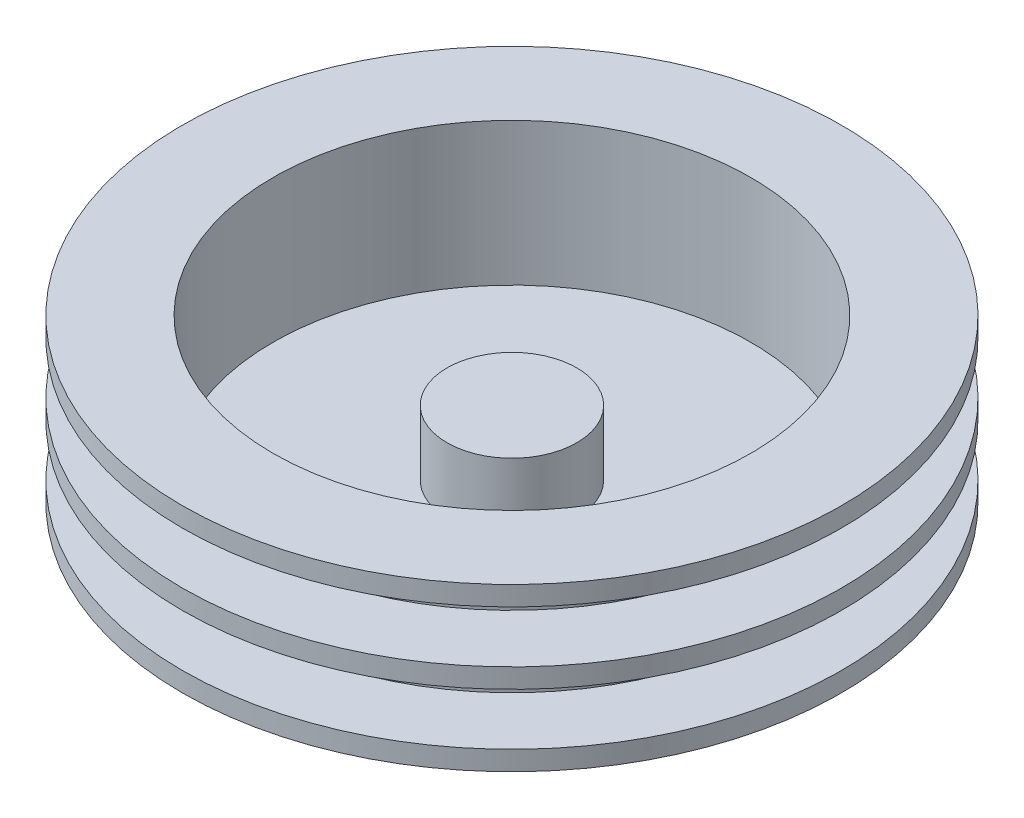
ISO-10303-21;
HEADER;
FILE_DESCRIPTION(('STEP AP214'),'2;1');
FILE_NAME('part.step','',(''),(''),'','','');
FILE_SCHEMA(('AUTOMOTIVE_DESIGN { 1 0 10303 214 1 1 1 1 }'));
ENDSEC;
DATA;
#1=APPLICATION_CONTEXT('core data for automotive mechanical design processes');
#2=APPLICATION_PROTOCOL_DEFINITION('international standard','automotive_design',2000,#1);
#3=PRODUCT_CONTEXT('',#1,'mechanical');
#4=PRODUCT('Part','Part','',(#3));
#5=PRODUCT_RELATED_PRODUCT_CATEGORY('part','',(#4));
#6=PRODUCT_DEFINITION_FORMATION('','',#4);
#7=PRODUCT_DEFINITION_CONTEXT('part definition',#1,'design');
#8=PRODUCT_DEFINITION('design','',#6,#7);
#9=PRODUCT_DEFINITION_SHAPE('','',#8);
#10=(LENGTH_UNIT() NAMED_UNIT(*) SI_UNIT(.MILLI.,.METRE.));
#11=(NAMED_UNIT(*) PLANE_ANGLE_UNIT() SI_UNIT($,.RADIAN.));
#12=(NAMED_UNIT(*) SI_UNIT($,.STERADIAN.) SOLID_ANGLE_UNIT());
#13=UNCERTAINTY_MEASURE_WITH_UNIT(LENGTH_MEASURE(1.E-05),#10,'distance_accuracy_value','');
#14=(GEOMETRIC_REPRESENTATION_CONTEXT(3) GLOBAL_UNCERTAINTY_ASSIGNED_CONTEXT((#13)) GLOBAL_UNIT_ASSIGNED_CONTEXT((#10,
#11,#12)) REPRESENTATION_CONTEXT('',''));
#15=CARTESIAN_POINT('',(0.,0.,0.));
#16=DIRECTION('',(0.,0.,1.));
#17=DIRECTION('',(1.,0.,0.));
#18=AXIS2_PLACEMENT_3D('',#15,#16,#17);
#19=CARTESIAN_POINT('',(0.,7.,0.));
#20=DIRECTION('',(0.,1.,0.));
#21=DIRECTION('',(0.,0.,1.));
#22=AXIS2_PLACEMENT_3D('',#19,#20,#21);
#23=PLANE('',#22);
#24=CARTESIAN_POINT('',(0.,7.,0.));
#25=DIRECTION('',(0.,1.,0.));
#26=DIRECTION('',(0.,0.,1.));
#27=AXIS2_PLACEMENT_3D('',#24,#25,#26);
#28=CIRCLE('',#27,25.4);
#29=CARTESIAN_POINT('',(0.,7.,25.4));
#30=VERTEX_POINT('',#29);
#31=EDGE_CURVE('E75',#30,#30,#28,.T.);
#32=ORIENTED_EDGE('',*,*,#31,.T.);
#33=EDGE_LOOP('',(#32));
#34=FACE_BOUND('',#33,.T.);
#35=CARTESIAN_POINT('',(0.,7.,0.));
#36=DIRECTION('',(0.,1.,0.));
#37=DIRECTION('',(0.,0.,1.));
#38=AXIS2_PLACEMENT_3D('',#35,#36,#37);
#39=CIRCLE('',#38,20.066);
#40=CARTESIAN_POINT('',(0.,7.,20.066));
#41=VERTEX_POINT('',#40);
#42=EDGE_CURVE('E84',#41,#41,#39,.T.);
#43=ORIENTED_EDGE('',*,*,#42,.F.);
#44=EDGE_LOOP('',(#43));
#45=FACE_BOUND('',#44,.T.);
#46=ADVANCED_FACE('F54',(#34,#45),#23,.T.);
#47=CARTESIAN_POINT('',(0.,1.5,0.));
#48=DIRECTION('',(0.,-1.,0.));
#49=DIRECTION('',(0.,0.,-1.));
#50=AXIS2_PLACEMENT_3D('',#47,#48,#49);
#51=CYLINDRICAL_SURFACE('',#50,25.4);
#52=CARTESIAN_POINT('',(0.,1.5,0.));
#53=DIRECTION('',(0.,1.,0.));
#54=DIRECTION('',(0.,0.,1.));
#55=AXIS2_PLACEMENT_3D('',#52,#53,#54);
#56=CIRCLE('',#55,25.4);
#57=CARTESIAN_POINT('',(0.,1.5,25.4));
#58=VERTEX_POINT('',#57);
#59=EDGE_CURVE('E61',#58,#58,#56,.T.);
#60=ORIENTED_EDGE('',*,*,#59,.F.);
#61=EDGE_LOOP('',(#60));
#62=FACE_BOUND('',#61,.T.);
#63=CARTESIAN_POINT('',(0.,0.,0.));
#64=DIRECTION('',(0.,1.,0.));
#65=DIRECTION('',(0.,0.,1.));
#66=AXIS2_PLACEMENT_3D('',#63,#64,#65);
#67=CIRCLE('',#66,25.4);
#68=CARTESIAN_POINT('',(0.,0.,25.4));
#69=VERTEX_POINT('',#68);
#70=EDGE_CURVE('E65',#69,#69,#67,.T.);
#71=ORIENTED_EDGE('',*,*,#70,.T.);
#72=EDGE_LOOP('',(#71));
#73=FACE_BOUND('',#72,.T.);
#74=ADVANCED_FACE('F56',(#62,#73),#51,.T.);
#75=CARTESIAN_POINT('',(0.,1.5,0.));
#76=DIRECTION('',(0.,1.,0.));
#77=DIRECTION('',(0.,0.,1.));
#78=AXIS2_PLACEMENT_3D('',#75,#76,#77);
#79=PLANE('',#78);
#80=CARTESIAN_POINT('',(0.,1.5,0.));
#81=DIRECTION('',(0.,1.,0.));
#82=DIRECTION('',(0.,0.,1.));
#83=AXIS2_PLACEMENT_3D('',#80,#81,#82);
#84=CIRCLE('',#83,20.066);
#85=CARTESIAN_POINT('',(0.,1.5,20.066));
#86=VERTEX_POINT('',#85);
#87=EDGE_CURVE('E72',#86,#86,#84,.T.);
#88=ORIENTED_EDGE('',*,*,#87,.F.);
#89=EDGE_LOOP('',(#88));
#90=FACE_BOUND('',#89,.T.);
#91=ORIENTED_EDGE('',*,*,#59,.T.);
#92=EDGE_LOOP('',(#91));
#93=FACE_BOUND('',#92,.T.);
#94=ADVANCED_FACE('F119',(#90,#93),#79,.T.);
#95=CARTESIAN_POINT('',(0.,0.,0.));
#96=DIRECTION('',(0.,1.,0.));
#97=DIRECTION('',(0.,0.,1.));
#98=AXIS2_PLACEMENT_3D('',#95,#96,#97);
#99=PLANE('',#98);
#100=ORIENTED_EDGE('',*,*,#70,.F.);
#101=EDGE_LOOP('',(#100));
#102=FACE_BOUND('',#101,.T.);
#103=ADVANCED_FACE('F130',(#102),#99,.F.);
#104=CARTESIAN_POINT('',(0.,5.5,0.));
#105=DIRECTION('',(0.,-1.,0.));
#106=DIRECTION('',(0.,0.,-1.));
#107=AXIS2_PLACEMENT_3D('',#104,#105,#106);
#108=CYLINDRICAL_SURFACE('',#107,20.066);
#109=CARTESIAN_POINT('',(0.,5.5,0.));
#110=DIRECTION('',(0.,1.,0.));
#111=DIRECTION('',(0.,0.,1.));
#112=AXIS2_PLACEMENT_3D('',#109,#110,#111);
#113=CIRCLE('',#112,20.066);
#114=CARTESIAN_POINT('',(0.,5.5,20.066));
#115=VERTEX_POINT('',#114);
#116=EDGE_CURVE('E70',#115,#115,#113,.T.);
#117=ORIENTED_EDGE('',*,*,#116,.F.);
#118=EDGE_LOOP('',(#117));
#119=FACE_BOUND('',#118,.T.);
#120=ORIENTED_EDGE('',*,*,#87,.T.);
#121=EDGE_LOOP('',(#120));
#122=FACE_BOUND('',#121,.T.);
#123=ADVANCED_FACE('F147',(#119,#122),#108,.T.);
#124=CARTESIAN_POINT('',(0.,5.5,0.));
#125=DIRECTION('',(0.,1.,0.));
#126=DIRECTION('',(0.,0.,1.));
#127=AXIS2_PLACEMENT_3D('',#124,#125,#126);
#128=PLANE('',#127);
#129=ORIENTED_EDGE('',*,*,#116,.T.);
#130=EDGE_LOOP('',(#129));
#131=FACE_BOUND('',#130,.T.);
#132=CARTESIAN_POINT('',(0.,5.5,0.));
#133=DIRECTION('',(0.,1.,0.));
#134=DIRECTION('',(0.,0.,1.));
#135=AXIS2_PLACEMENT_3D('',#132,#133,#134);
#136=CIRCLE('',#135,25.4);
#137=CARTESIAN_POINT('',(0.,5.5,25.4));
#138=VERTEX_POINT('',#137);
#139=EDGE_CURVE('E78',#138,#138,#136,.T.);
#140=ORIENTED_EDGE('',*,*,#139,.F.);
#141=EDGE_LOOP('',(#140));
#142=FACE_BOUND('',#141,.T.);
#143=ADVANCED_FACE('F143',(#131,#142),#128,.F.);
#144=CARTESIAN_POINT('',(0.,7.,0.));
#145=DIRECTION('',(0.,-1.,0.));
#146=DIRECTION('',(0.,0.,-1.));
#147=AXIS2_PLACEMENT_3D('',#144,#145,#146);
#148=CYLINDRICAL_SURFACE('',#147,25.4);
#149=ORIENTED_EDGE('',*,*,#31,.F.);
#150=EDGE_LOOP('',(#149));
#151=FACE_BOUND('',#150,.T.);
#152=ORIENTED_EDGE('',*,*,#139,.T.);
#153=EDGE_LOOP('',(#152));
#154=FACE_BOUND('',#153,.T.);
#155=ADVANCED_FACE('F146',(#151,#154),#148,.T.);
#156=CARTESIAN_POINT('',(0.,11.,0.));
#157=DIRECTION('',(0.,-1.,0.));
#158=DIRECTION('',(0.,0.,-1.));
#159=AXIS2_PLACEMENT_3D('',#156,#157,#158);
#160=CYLINDRICAL_SURFACE('',#159,20.066);
#161=CARTESIAN_POINT('',(0.,11.,0.));
#162=DIRECTION('',(0.,1.,0.));
#163=DIRECTION('',(0.,0.,1.));
#164=AXIS2_PLACEMENT_3D('',#161,#162,#163);
#165=CIRCLE('',#164,20.066);
#166=CARTESIAN_POINT('',(0.,11.,20.066));
#167=VERTEX_POINT('',#166);
#168=EDGE_CURVE('E81',#167,#167,#165,.T.);
#169=ORIENTED_EDGE('',*,*,#168,.F.);
#170=EDGE_LOOP('',(#169));
#171=FACE_BOUND('',#170,.T.);
#172=ORIENTED_EDGE('',*,*,#42,.T.);
#173=EDGE_LOOP('',(#172));
#174=FACE_BOUND('',#173,.T.);
#175=ADVANCED_FACE('F142',(#171,#174),#160,.T.);
#176=CARTESIAN_POINT('',(0.,12.5,0.));
#177=DIRECTION('',(0.,1.,0.));
#178=DIRECTION('',(0.,0.,1.));
#179=AXIS2_PLACEMENT_3D('',#176,#177,#178);
#180=PLANE('',#179);
#181=CARTESIAN_POINT('',(0.,12.5,0.));
#182=DIRECTION('',(0.,1.,0.));
#183=DIRECTION('',(0.,0.,1.));
#184=AXIS2_PLACEMENT_3D('',#181,#182,#183);
#185=CIRCLE('',#184,25.4);
#186=CARTESIAN_POINT('',(0.,12.5,25.4));
#187=VERTEX_POINT('',#186);
#188=EDGE_CURVE('E87',#187,#187,#185,.T.);
#189=ORIENTED_EDGE('',*,*,#188,.T.);
#190=EDGE_LOOP('',(#189));
#191=FACE_BOUND('',#190,.T.);
#192=CARTESIAN_POINT('',(0.,12.5,0.));
#193=DIRECTION('',(0.,1.,0.));
#194=DIRECTION('',(0.,0.,1.));
#195=AXIS2_PLACEMENT_3D('',#192,#193,#194);
#196=CIRCLE('',#195,18.415);
#197=CARTESIAN_POINT('',(0.,12.5,18.415));
#198=VERTEX_POINT('',#197);
#199=EDGE_CURVE('E93',#198,#198,#196,.T.);
#200=ORIENTED_EDGE('',*,*,#199,.F.);
#201=EDGE_LOOP('',(#200));
#202=FACE_BOUND('',#201,.T.);
#203=ADVANCED_FACE('F224',(#191,#202),#180,.T.);
#204=CARTESIAN_POINT('',(0.,11.,0.));
#205=DIRECTION('',(0.,1.,0.));
#206=DIRECTION('',(0.,0.,1.));
#207=AXIS2_PLACEMENT_3D('',#204,#205,#206);
#208=PLANE('',#207);
#209=ORIENTED_EDGE('',*,*,#168,.T.);
#210=EDGE_LOOP('',(#209));
#211=FACE_BOUND('',#210,.T.);
#212=CARTESIAN_POINT('',(0.,11.,0.));
#213=DIRECTION('',(0.,1.,0.));
#214=DIRECTION('',(0.,0.,1.));
#215=AXIS2_PLACEMENT_3D('',#212,#213,#214);
#216=CIRCLE('',#215,25.4);
#217=CARTESIAN_POINT('',(0.,11.,25.4));
#218=VERTEX_POINT('',#217);
#219=EDGE_CURVE('E90',#218,#218,#216,.T.);
#220=ORIENTED_EDGE('',*,*,#219,.F.);
#221=EDGE_LOOP('',(#220));
#222=FACE_BOUND('',#221,.T.);
#223=ADVANCED_FACE('F125',(#211,#222),#208,.F.);
#224=CARTESIAN_POINT('',(0.,12.5,0.));
#225=DIRECTION('',(0.,-1.,0.));
#226=DIRECTION('',(0.,0.,-1.));
#227=AXIS2_PLACEMENT_3D('',#224,#225,#226);
#228=CYLINDRICAL_SURFACE('',#227,25.4);
#229=ORIENTED_EDGE('',*,*,#188,.F.);
#230=EDGE_LOOP('',(#229));
#231=FACE_BOUND('',#230,.T.);
#232=ORIENTED_EDGE('',*,*,#219,.T.);
#233=EDGE_LOOP('',(#232));
#234=FACE_BOUND('',#233,.T.);
#235=ADVANCED_FACE('F117',(#231,#234),#228,.T.);
#236=CARTESIAN_POINT('',(0.,1.5,0.));
#237=DIRECTION('',(0.,1.,0.));
#238=DIRECTION('',(0.,0.,1.));
#239=AXIS2_PLACEMENT_3D('',#236,#237,#238);
#240=CIRCLE('',#239,5.);
#241=CARTESIAN_POINT('',(0.,1.5,5.));
#242=VERTEX_POINT('',#241);
#243=EDGE_CURVE('E99',#242,#242,#240,.T.);
#244=ORIENTED_EDGE('',*,*,#243,.F.);
#245=EDGE_LOOP('',(#244));
#246=FACE_BOUND('',#245,.T.);
#247=CARTESIAN_POINT('',(0.,1.5,0.));
#248=DIRECTION('',(0.,1.,0.));
#249=DIRECTION('',(0.,0.,1.));
#250=AXIS2_PLACEMENT_3D('',#247,#248,#249);
#251=CIRCLE('',#250,18.415);
#252=CARTESIAN_POINT('',(0.,1.5,18.415));
#253=VERTEX_POINT('',#252);
#254=EDGE_CURVE('E11',#253,#253,#251,.F.);
#255=ORIENTED_EDGE('',*,*,#254,.F.);
#256=EDGE_LOOP('',(#255));
#257=FACE_BOUND('',#256,.T.);
#258=ADVANCED_FACE('F114',(#246,#257),#79,.T.);
#259=CARTESIAN_POINT('',(0.,5.5,0.));
#260=DIRECTION('',(0.,-1.,0.));
#261=DIRECTION('',(0.,0.,-1.));
#262=AXIS2_PLACEMENT_3D('',#259,#260,#261);
#263=CYLINDRICAL_SURFACE('',#262,18.415);
#264=ORIENTED_EDGE('',*,*,#254,.T.);
#265=EDGE_LOOP('',(#264));
#266=FACE_BOUND('',#265,.T.);
#267=ORIENTED_EDGE('',*,*,#199,.T.);
#268=EDGE_LOOP('',(#267));
#269=FACE_BOUND('',#268,.T.);
#270=ADVANCED_FACE('F110',(#266,#269),#263,.F.);
#271=CARTESIAN_POINT('',(0.,6.5,0.));
#272=DIRECTION('',(0.,-1.,0.));
#273=DIRECTION('',(0.,0.,-1.));
#274=AXIS2_PLACEMENT_3D('',#271,#272,#273);
#275=CYLINDRICAL_SURFACE('',#274,5.);
#276=CARTESIAN_POINT('',(0.,6.5,0.));
#277=DIRECTION('',(0.,1.,0.));
#278=DIRECTION('',(0.,0.,1.));
#279=AXIS2_PLACEMENT_3D('',#276,#277,#278);
#280=CIRCLE('',#279,5.);
#281=CARTESIAN_POINT('',(0.,6.5,5.));
#282=VERTEX_POINT('',#281);
#283=EDGE_CURVE('E98',#282,#282,#280,.T.);
#284=ORIENTED_EDGE('',*,*,#283,.F.);
#285=EDGE_LOOP('',(#284));
#286=FACE_BOUND('',#285,.T.);
#287=ORIENTED_EDGE('',*,*,#243,.T.);
#288=EDGE_LOOP('',(#287));
#289=FACE_BOUND('',#288,.T.);
#290=ADVANCED_FACE('F107',(#286,#289),#275,.T.);
#291=CARTESIAN_POINT('',(0.,6.5,0.));
#292=DIRECTION('',(0.,1.,0.));
#293=DIRECTION('',(0.,0.,1.));
#294=AXIS2_PLACEMENT_3D('',#291,#292,#293);
#295=PLANE('',#294);
#296=ORIENTED_EDGE('',*,*,#283,.T.);
#297=EDGE_LOOP('',(#296));
#298=FACE_BOUND('',#297,.T.);
#299=ADVANCED_FACE('F105',(#298),#295,.T.);
#300=CLOSED_SHELL('',(#46,#74,#94,#103,#123,#143,#155,#175,#203,#223,#235,#258,#270,#290,#299));
#301=MANIFOLD_SOLID_BREP('B2',#300);
#302=ADVANCED_BREP_SHAPE_REPRESENTATION('',(#18,#301),#14);
#303=SHAPE_DEFINITION_REPRESENTATION(#9,#302);
ENDSEC;
END-ISO-10303-21;
